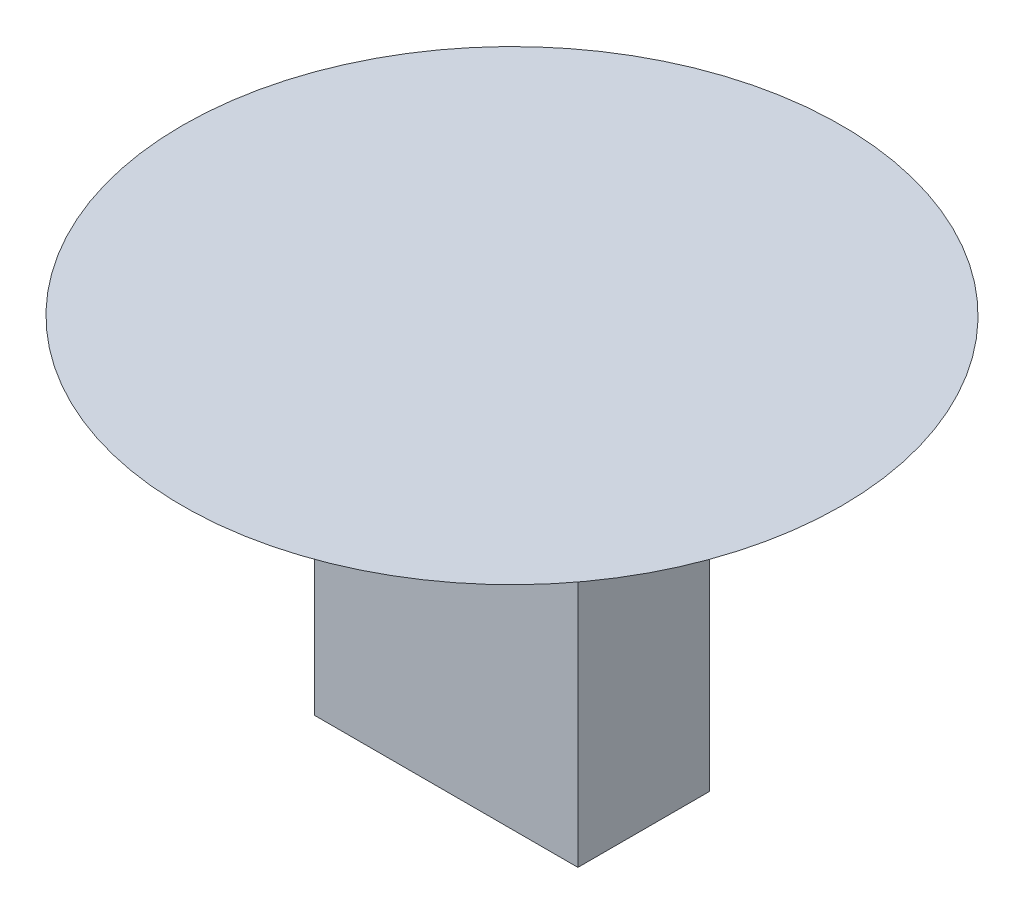
ISO-10303-21;
HEADER;
FILE_DESCRIPTION(('STEP AP214'),'2;1');
FILE_NAME('part.step','',(''),(''),'','','');
FILE_SCHEMA(('AUTOMOTIVE_DESIGN { 1 0 10303 214 1 1 1 1 }'));
ENDSEC;
DATA;
#1=APPLICATION_CONTEXT('core data for automotive mechanical design processes');
#2=APPLICATION_PROTOCOL_DEFINITION('international standard','automotive_design',2000,#1);
#3=PRODUCT_CONTEXT('',#1,'mechanical');
#4=PRODUCT('Part','Part','',(#3));
#5=PRODUCT_RELATED_PRODUCT_CATEGORY('part','',(#4));
#6=PRODUCT_DEFINITION_FORMATION('','',#4);
#7=PRODUCT_DEFINITION_CONTEXT('part definition',#1,'design');
#8=PRODUCT_DEFINITION('design','',#6,#7);
#9=PRODUCT_DEFINITION_SHAPE('','',#8);
#10=(LENGTH_UNIT() NAMED_UNIT(*) SI_UNIT(.MILLI.,.METRE.));
#11=(NAMED_UNIT(*) PLANE_ANGLE_UNIT() SI_UNIT($,.RADIAN.));
#12=(NAMED_UNIT(*) SI_UNIT($,.STERADIAN.) SOLID_ANGLE_UNIT());
#13=UNCERTAINTY_MEASURE_WITH_UNIT(LENGTH_MEASURE(1.E-05),#10,'distance_accuracy_value','');
#14=(GEOMETRIC_REPRESENTATION_CONTEXT(3) GLOBAL_UNCERTAINTY_ASSIGNED_CONTEXT((#13)) GLOBAL_UNIT_ASSIGNED_CONTEXT((#10,
#11,#12)) REPRESENTATION_CONTEXT('',''));
#15=CARTESIAN_POINT('',(0.,0.,0.));
#16=DIRECTION('',(0.,0.,1.));
#17=DIRECTION('',(1.,0.,0.));
#18=AXIS2_PLACEMENT_3D('',#15,#16,#17);
#19=CARTESIAN_POINT('',(0.,200.,0.));
#20=DIRECTION('',(0.,1.,0.));
#21=DIRECTION('',(0.,0.,1.));
#22=AXIS2_PLACEMENT_3D('',#19,#20,#21);
#23=PLANE('',#22);
#24=CARTESIAN_POINT('',(0.,200.,0.));
#25=DIRECTION('',(0.,1.,0.));
#26=DIRECTION('',(-1.,0.,0.));
#27=AXIS2_PLACEMENT_3D('',#24,#25,#26);
#28=CIRCLE('',#27,80.);
#29=CARTESIAN_POINT('',(69.2820323027551,200.,40.));
#30=VERTEX_POINT('',#29);
#31=CARTESIAN_POINT('',(80.,200.,0.));
#32=VERTEX_POINT('',#31);
#33=EDGE_CURVE('E11',#30,#32,#28,.T.);
#34=ORIENTED_EDGE('',*,*,#33,.F.);
#35=DIRECTION('',(1.,0.,0.));
#36=VECTOR('',#35,1.);
#37=CARTESIAN_POINT('',(-80.,200.,40.));
#38=LINE('',#37,#36);
#39=CARTESIAN_POINT('',(80.,200.,40.));
#40=VERTEX_POINT('',#39);
#41=EDGE_CURVE('E109',#30,#40,#38,.T.);
#42=ORIENTED_EDGE('',*,*,#41,.T.);
#43=DIRECTION('',(0.,0.,-1.));
#44=VECTOR('',#43,1.);
#45=CARTESIAN_POINT('',(80.,200.,-40.));
#46=LINE('',#45,#44);
#47=EDGE_CURVE('E139',#40,#32,#46,.T.);
#48=ORIENTED_EDGE('',*,*,#47,.T.);
#49=EDGE_LOOP('',(#34,#42,#48));
#50=FACE_BOUND('',#49,.T.);
#51=ADVANCED_FACE('F38',(#50),#23,.T.);
#52=CARTESIAN_POINT('',(69.2820323027551,200.,-40.));
#53=VERTEX_POINT('',#52);
#54=EDGE_CURVE('E47',#32,#53,#28,.T.);
#55=ORIENTED_EDGE('',*,*,#54,.F.);
#56=CARTESIAN_POINT('',(80.,200.,-40.));
#57=VERTEX_POINT('',#56);
#58=EDGE_CURVE('E141',#32,#57,#46,.T.);
#59=ORIENTED_EDGE('',*,*,#58,.T.);
#60=DIRECTION('',(-1.,0.,0.));
#61=VECTOR('',#60,1.);
#62=CARTESIAN_POINT('',(-80.,200.,-40.));
#63=LINE('',#62,#61);
#64=EDGE_CURVE('E118',#57,#53,#63,.T.);
#65=ORIENTED_EDGE('',*,*,#64,.T.);
#66=EDGE_LOOP('',(#55,#59,#65));
#67=FACE_BOUND('',#66,.T.);
#68=ADVANCED_FACE('F182',(#67),#23,.T.);
#69=CARTESIAN_POINT('',(-80.,200.,0.));
#70=VERTEX_POINT('',#69);
#71=CARTESIAN_POINT('',(-69.2820323027551,200.,40.));
#72=VERTEX_POINT('',#71);
#73=EDGE_CURVE('E120',#70,#72,#28,.T.);
#74=ORIENTED_EDGE('',*,*,#73,.F.);
#75=DIRECTION('',(0.,0.,1.));
#76=VECTOR('',#75,1.);
#77=CARTESIAN_POINT('',(-80.,200.,-40.));
#78=LINE('',#77,#76);
#79=CARTESIAN_POINT('',(-80.,200.,40.));
#80=VERTEX_POINT('',#79);
#81=EDGE_CURVE('E110',#70,#80,#78,.T.);
#82=ORIENTED_EDGE('',*,*,#81,.T.);
#83=EDGE_CURVE('E122',#80,#72,#38,.T.);
#84=ORIENTED_EDGE('',*,*,#83,.T.);
#85=EDGE_LOOP('',(#74,#82,#84));
#86=FACE_BOUND('',#85,.T.);
#87=ADVANCED_FACE('F121',(#86),#23,.T.);
#88=CARTESIAN_POINT('',(80.,200.,-40.));
#89=DIRECTION('',(-1.,0.,0.));
#90=DIRECTION('',(0.,0.,1.));
#91=AXIS2_PLACEMENT_3D('',#88,#89,#90);
#92=PLANE('',#91);
#93=DIRECTION('',(0.,0.,-1.));
#94=VECTOR('',#93,1.);
#95=CARTESIAN_POINT('',(80.,0.,-40.));
#96=LINE('',#95,#94);
#97=CARTESIAN_POINT('',(80.,0.,40.));
#98=VERTEX_POINT('',#97);
#99=CARTESIAN_POINT('',(80.,0.,-40.));
#100=VERTEX_POINT('',#99);
#101=EDGE_CURVE('E138',#98,#100,#96,.T.);
#102=ORIENTED_EDGE('',*,*,#101,.T.);
#103=DIRECTION('',(0.,-1.,0.));
#104=VECTOR('',#103,1.);
#105=CARTESIAN_POINT('',(80.,200.,-40.));
#106=LINE('',#105,#104);
#107=EDGE_CURVE('E42',#57,#100,#106,.T.);
#108=ORIENTED_EDGE('',*,*,#107,.F.);
#109=ORIENTED_EDGE('',*,*,#58,.F.);
#110=ORIENTED_EDGE('',*,*,#47,.F.);
#111=DIRECTION('',(0.,-1.,0.));
#112=VECTOR('',#111,1.);
#113=CARTESIAN_POINT('',(80.,200.,40.));
#114=LINE('',#113,#112);
#115=EDGE_CURVE('E146',#40,#98,#114,.T.);
#116=ORIENTED_EDGE('',*,*,#115,.T.);
#117=EDGE_LOOP('',(#102,#108,#109,#110,#116));
#118=FACE_BOUND('',#117,.T.);
#119=ADVANCED_FACE('F40',(#118),#92,.F.);
#120=CARTESIAN_POINT('',(-80.,200.,-40.));
#121=DIRECTION('',(0.,0.,1.));
#122=DIRECTION('',(1.,0.,0.));
#123=AXIS2_PLACEMENT_3D('',#120,#121,#122);
#124=PLANE('',#123);
#125=DIRECTION('',(-1.,0.,0.));
#126=VECTOR('',#125,1.);
#127=CARTESIAN_POINT('',(-80.,0.,-40.));
#128=LINE('',#127,#126);
#129=CARTESIAN_POINT('',(-80.,0.,-40.));
#130=VERTEX_POINT('',#129);
#131=EDGE_CURVE('E149',#100,#130,#128,.T.);
#132=ORIENTED_EDGE('',*,*,#131,.T.);
#133=DIRECTION('',(0.,-1.,0.));
#134=VECTOR('',#133,1.);
#135=CARTESIAN_POINT('',(-80.,200.,-40.));
#136=LINE('',#135,#134);
#137=CARTESIAN_POINT('',(-80.,200.,-40.));
#138=VERTEX_POINT('',#137);
#139=EDGE_CURVE('E134',#138,#130,#136,.T.);
#140=ORIENTED_EDGE('',*,*,#139,.F.);
#141=CARTESIAN_POINT('',(-69.2820323027551,200.,-40.));
#142=VERTEX_POINT('',#141);
#143=EDGE_CURVE('E105',#142,#138,#63,.T.);
#144=ORIENTED_EDGE('',*,*,#143,.F.);
#145=EDGE_CURVE('E143',#53,#142,#63,.T.);
#146=ORIENTED_EDGE('',*,*,#145,.F.);
#147=ORIENTED_EDGE('',*,*,#64,.F.);
#148=ORIENTED_EDGE('',*,*,#107,.T.);
#149=EDGE_LOOP('',(#132,#140,#144,#146,#147,#148));
#150=FACE_BOUND('',#149,.T.);
#151=ADVANCED_FACE('F200',(#150),#124,.F.);
#152=CARTESIAN_POINT('',(-80.,200.,-40.));
#153=DIRECTION('',(1.,0.,0.));
#154=DIRECTION('',(0.,0.,-1.));
#155=AXIS2_PLACEMENT_3D('',#152,#153,#154);
#156=PLANE('',#155);
#157=DIRECTION('',(0.,0.,1.));
#158=VECTOR('',#157,1.);
#159=CARTESIAN_POINT('',(-80.,0.,-40.));
#160=LINE('',#159,#158);
#161=CARTESIAN_POINT('',(-80.,0.,40.));
#162=VERTEX_POINT('',#161);
#163=EDGE_CURVE('E151',#130,#162,#160,.T.);
#164=ORIENTED_EDGE('',*,*,#163,.T.);
#165=DIRECTION('',(0.,-1.,0.));
#166=VECTOR('',#165,1.);
#167=CARTESIAN_POINT('',(-80.,200.,40.));
#168=LINE('',#167,#166);
#169=EDGE_CURVE('E116',#80,#162,#168,.T.);
#170=ORIENTED_EDGE('',*,*,#169,.F.);
#171=ORIENTED_EDGE('',*,*,#81,.F.);
#172=EDGE_CURVE('E99',#138,#70,#78,.T.);
#173=ORIENTED_EDGE('',*,*,#172,.F.);
#174=ORIENTED_EDGE('',*,*,#139,.T.);
#175=EDGE_LOOP('',(#164,#170,#171,#173,#174));
#176=FACE_BOUND('',#175,.T.);
#177=ADVANCED_FACE('F114',(#176),#156,.F.);
#178=CARTESIAN_POINT('',(-80.,200.,40.));
#179=DIRECTION('',(0.,0.,-1.));
#180=DIRECTION('',(-1.,0.,0.));
#181=AXIS2_PLACEMENT_3D('',#178,#179,#180);
#182=PLANE('',#181);
#183=DIRECTION('',(1.,0.,0.));
#184=VECTOR('',#183,1.);
#185=CARTESIAN_POINT('',(-80.,0.,40.));
#186=LINE('',#185,#184);
#187=EDGE_CURVE('E153',#162,#98,#186,.T.);
#188=ORIENTED_EDGE('',*,*,#187,.T.);
#189=ORIENTED_EDGE('',*,*,#115,.F.);
#190=ORIENTED_EDGE('',*,*,#41,.F.);
#191=EDGE_CURVE('E61',#72,#30,#38,.T.);
#192=ORIENTED_EDGE('',*,*,#191,.F.);
#193=ORIENTED_EDGE('',*,*,#83,.F.);
#194=ORIENTED_EDGE('',*,*,#169,.T.);
#195=EDGE_LOOP('',(#188,#189,#190,#192,#193,#194));
#196=FACE_BOUND('',#195,.T.);
#197=ADVANCED_FACE('F164',(#196),#182,.F.);
#198=EDGE_CURVE('E103',#142,#70,#28,.T.);
#199=ORIENTED_EDGE('',*,*,#198,.F.);
#200=ORIENTED_EDGE('',*,*,#143,.T.);
#201=ORIENTED_EDGE('',*,*,#172,.T.);
#202=EDGE_LOOP('',(#199,#200,#201));
#203=FACE_BOUND('',#202,.T.);
#204=ADVANCED_FACE('F101',(#203),#23,.T.);
#205=CARTESIAN_POINT('',(0.,0.,0.));
#206=DIRECTION('',(0.,1.,0.));
#207=DIRECTION('',(0.,0.,1.));
#208=AXIS2_PLACEMENT_3D('',#205,#206,#207);
#209=PLANE('',#208);
#210=ORIENTED_EDGE('',*,*,#101,.F.);
#211=ORIENTED_EDGE('',*,*,#187,.F.);
#212=ORIENTED_EDGE('',*,*,#163,.F.);
#213=ORIENTED_EDGE('',*,*,#131,.F.);
#214=EDGE_LOOP('',(#210,#211,#212,#213));
#215=FACE_BOUND('',#214,.T.);
#216=ADVANCED_FACE('F162',(#215),#209,.F.);
#217=CARTESIAN_POINT('',(-80.,200.,0.));
#218=DIRECTION('',(0.,-1.,0.));
#219=DIRECTION('',(1.,0.,0.));
#220=AXIS2_PLACEMENT_3D('',#217,#218,#219);
#221=PLANE('',#220);
#222=EDGE_CURVE('E127',#53,#142,#28,.T.);
#223=ORIENTED_EDGE('',*,*,#222,.F.);
#224=ORIENTED_EDGE('',*,*,#145,.T.);
#225=EDGE_LOOP('',(#223,#224));
#226=FACE_BOUND('',#225,.T.);
#227=ADVANCED_FACE('F173',(#226),#221,.T.);
#228=CARTESIAN_POINT('',(0.,230.,0.));
#229=DIRECTION('',(0.,1.,0.));
#230=DIRECTION('',(-1.,0.,0.));
#231=AXIS2_PLACEMENT_3D('',#228,#229,#230);
#232=PLANE('',#231);
#233=CARTESIAN_POINT('',(0.,230.,0.));
#234=DIRECTION('',(0.,1.,0.));
#235=DIRECTION('',(-1.,0.,0.));
#236=AXIS2_PLACEMENT_3D('',#233,#234,#235);
#237=CIRCLE('',#236,200.);
#238=CARTESIAN_POINT('',(-200.,230.,0.));
#239=VERTEX_POINT('',#238);
#240=EDGE_CURVE('E126',#239,#239,#237,.T.);
#241=ORIENTED_EDGE('',*,*,#240,.T.);
#242=EDGE_LOOP('',(#241));
#243=FACE_BOUND('',#242,.T.);
#244=ADVANCED_FACE('F177',(#243),#232,.T.);
#245=CARTESIAN_POINT('',(0.,230.,0.));
#246=DIRECTION('',(0.,1.,0.));
#247=DIRECTION('',(-1.,0.,0.));
#248=AXIS2_PLACEMENT_3D('',#245,#246,#247);
#249=CONICAL_SURFACE('',#248,200.,1.32581766366803);
#250=ORIENTED_EDGE('',*,*,#73,.T.);
#251=EDGE_CURVE('E49',#72,#30,#28,.T.);
#252=ORIENTED_EDGE('',*,*,#251,.T.);
#253=ORIENTED_EDGE('',*,*,#33,.T.);
#254=ORIENTED_EDGE('',*,*,#54,.T.);
#255=ORIENTED_EDGE('',*,*,#222,.T.);
#256=ORIENTED_EDGE('',*,*,#198,.T.);
#257=EDGE_LOOP('',(#250,#252,#253,#254,#255,#256));
#258=FACE_BOUND('',#257,.T.);
#259=ORIENTED_EDGE('',*,*,#240,.F.);
#260=EDGE_LOOP('',(#259));
#261=FACE_BOUND('',#260,.T.);
#262=ADVANCED_FACE('F129',(#258,#261),#249,.T.);
#263=ORIENTED_EDGE('',*,*,#251,.F.);
#264=ORIENTED_EDGE('',*,*,#191,.T.);
#265=EDGE_LOOP('',(#263,#264));
#266=FACE_BOUND('',#265,.T.);
#267=ADVANCED_FACE('F170',(#266),#221,.T.);
#268=CLOSED_SHELL('',(#51,#68,#87,#119,#151,#177,#197,#204,#216,#227,#244,#262,#267));
#269=MANIFOLD_SOLID_BREP('B2',#268);
#270=ADVANCED_BREP_SHAPE_REPRESENTATION('',(#18,#269),#14);
#271=SHAPE_DEFINITION_REPRESENTATION(#9,#270);
ENDSEC;
END-ISO-10303-21;
